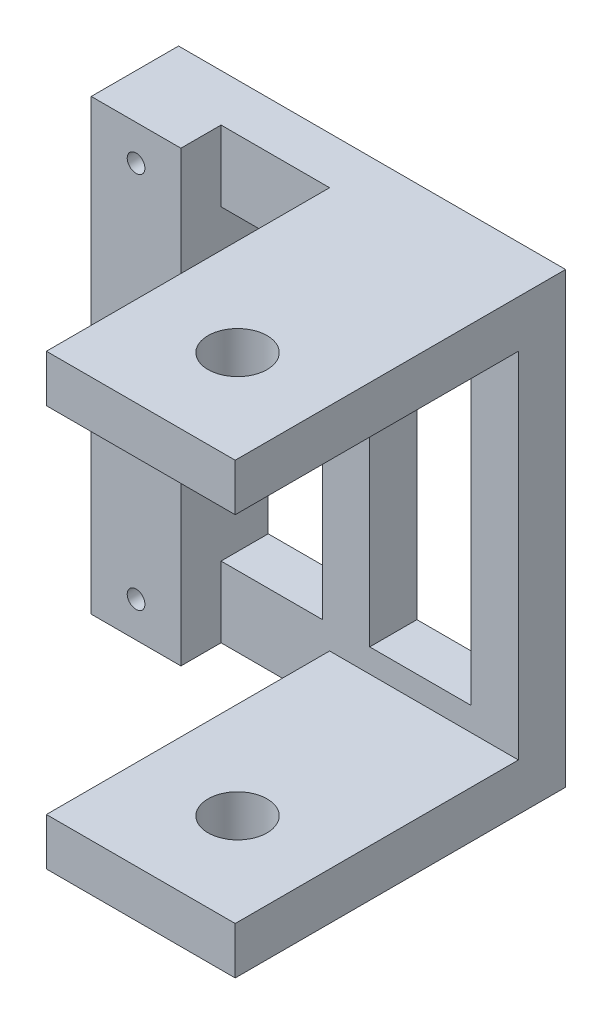
ISO-10303-21;
HEADER;
FILE_DESCRIPTION(('STEP AP214'),'2;1');
FILE_NAME('part.step','',(''),(''),'','','');
FILE_SCHEMA(('AUTOMOTIVE_DESIGN { 1 0 10303 214 1 1 1 1 }'));
ENDSEC;
DATA;
#1=APPLICATION_CONTEXT('core data for automotive mechanical design processes');
#2=APPLICATION_PROTOCOL_DEFINITION('international standard','automotive_design',2000,#1);
#3=PRODUCT_CONTEXT('',#1,'mechanical');
#4=PRODUCT('Part','Part','',(#3));
#5=PRODUCT_RELATED_PRODUCT_CATEGORY('part','',(#4));
#6=PRODUCT_DEFINITION_FORMATION('','',#4);
#7=PRODUCT_DEFINITION_CONTEXT('part definition',#1,'design');
#8=PRODUCT_DEFINITION('design','',#6,#7);
#9=PRODUCT_DEFINITION_SHAPE('','',#8);
#10=(LENGTH_UNIT() NAMED_UNIT(*) SI_UNIT(.MILLI.,.METRE.));
#11=(NAMED_UNIT(*) PLANE_ANGLE_UNIT() SI_UNIT($,.RADIAN.));
#12=(NAMED_UNIT(*) SI_UNIT($,.STERADIAN.) SOLID_ANGLE_UNIT());
#13=UNCERTAINTY_MEASURE_WITH_UNIT(LENGTH_MEASURE(1.E-05),#10,'distance_accuracy_value','');
#14=(GEOMETRIC_REPRESENTATION_CONTEXT(3) GLOBAL_UNCERTAINTY_ASSIGNED_CONTEXT((#13)) GLOBAL_UNIT_ASSIGNED_CONTEXT((#10,
#11,#12)) REPRESENTATION_CONTEXT('',''));
#15=CARTESIAN_POINT('',(0.,0.,0.));
#16=DIRECTION('',(0.,0.,1.));
#17=DIRECTION('',(1.,0.,0.));
#18=AXIS2_PLACEMENT_3D('',#15,#16,#17);
#19=CARTESIAN_POINT('',(0.,0.,2.));
#20=DIRECTION('',(0.,0.,1.));
#21=DIRECTION('',(1.,0.,0.));
#22=AXIS2_PLACEMENT_3D('',#19,#20,#21);
#23=PLANE('',#22);
#24=DIRECTION('',(0.,1.,0.));
#25=VECTOR('',#24,1.);
#26=CARTESIAN_POINT('',(5.29999999999999,6.5,2.));
#27=LINE('',#26,#25);
#28=CARTESIAN_POINT('',(5.29999999999999,-6.5,2.));
#29=VERTEX_POINT('',#28);
#30=CARTESIAN_POINT('',(5.29999999999999,6.5,2.));
#31=VERTEX_POINT('',#30);
#32=EDGE_CURVE('E292',#29,#31,#27,.T.);
#33=ORIENTED_EDGE('',*,*,#32,.F.);
#34=DIRECTION('',(1.,0.,0.));
#35=VECTOR('',#34,1.);
#36=CARTESIAN_POINT('',(0.999999999999998,-6.5,2.));
#37=LINE('',#36,#35);
#38=CARTESIAN_POINT('',(0.999999999999998,-6.5,2.));
#39=VERTEX_POINT('',#38);
#40=EDGE_CURVE('E289',#39,#29,#37,.T.);
#41=ORIENTED_EDGE('',*,*,#40,.F.);
#42=DIRECTION('',(0.,-1.,0.));
#43=VECTOR('',#42,1.);
#44=CARTESIAN_POINT('',(0.999999999999998,-6.5,2.));
#45=LINE('',#44,#43);
#46=CARTESIAN_POINT('',(0.999999999999998,6.5,2.));
#47=VERTEX_POINT('',#46);
#48=EDGE_CURVE('E300',#47,#39,#45,.T.);
#49=ORIENTED_EDGE('',*,*,#48,.F.);
#50=DIRECTION('',(-1.,0.,0.));
#51=VECTOR('',#50,1.);
#52=CARTESIAN_POINT('',(0.999999999999998,6.5,2.));
#53=LINE('',#52,#51);
#54=EDGE_CURVE('E296',#31,#47,#53,.T.);
#55=ORIENTED_EDGE('',*,*,#54,.F.);
#56=EDGE_LOOP('',(#33,#41,#49,#55));
#57=FACE_BOUND('',#56,.T.);
#58=DIRECTION('',(-1.,0.,0.));
#59=VECTOR('',#58,1.);
#60=CARTESIAN_POINT('',(-9.1,9.5,2.));
#61=LINE('',#60,#59);
#62=CARTESIAN_POINT('',(-0.699999999999998,9.5,2.));
#63=VERTEX_POINT('',#62);
#64=CARTESIAN_POINT('',(-5.3,9.5,2.));
#65=VERTEX_POINT('',#64);
#66=EDGE_CURVE('E376',#63,#65,#61,.T.);
#67=ORIENTED_EDGE('',*,*,#66,.T.);
#68=DIRECTION('',(0.,1.,0.));
#69=VECTOR('',#68,1.);
#70=CARTESIAN_POINT('',(-5.3,9.5,2.));
#71=LINE('',#70,#69);
#72=CARTESIAN_POINT('',(-5.3,6.5,2.));
#73=VERTEX_POINT('',#72);
#74=EDGE_CURVE('E208',#73,#65,#71,.T.);
#75=ORIENTED_EDGE('',*,*,#74,.F.);
#76=DIRECTION('',(-1.,0.,0.));
#77=VECTOR('',#76,1.);
#78=CARTESIAN_POINT('',(-5.3,6.5,2.));
#79=LINE('',#78,#77);
#80=CARTESIAN_POINT('',(-1.,6.5,2.));
#81=VERTEX_POINT('',#80);
#82=EDGE_CURVE('E340',#81,#73,#79,.T.);
#83=ORIENTED_EDGE('',*,*,#82,.F.);
#84=DIRECTION('',(0.,1.,0.));
#85=VECTOR('',#84,1.);
#86=CARTESIAN_POINT('',(-1.,-6.5,2.));
#87=LINE('',#86,#85);
#88=CARTESIAN_POINT('',(-1.,-6.5,2.));
#89=VERTEX_POINT('',#88);
#90=EDGE_CURVE('E335',#89,#81,#87,.T.);
#91=ORIENTED_EDGE('',*,*,#90,.F.);
#92=DIRECTION('',(1.,0.,0.));
#93=VECTOR('',#92,1.);
#94=CARTESIAN_POINT('',(-5.3,-6.5,2.));
#95=LINE('',#94,#93);
#96=CARTESIAN_POINT('',(-5.3,-6.5,2.));
#97=VERTEX_POINT('',#96);
#98=EDGE_CURVE('E332',#97,#89,#95,.T.);
#99=ORIENTED_EDGE('',*,*,#98,.F.);
#100=CARTESIAN_POINT('',(-5.29999999999999,-9.5,2.));
#101=VERTEX_POINT('',#100);
#102=EDGE_CURVE('E205',#101,#97,#71,.T.);
#103=ORIENTED_EDGE('',*,*,#102,.F.);
#104=DIRECTION('',(1.,0.,0.));
#105=VECTOR('',#104,1.);
#106=CARTESIAN_POINT('',(-9.1,-9.5,2.));
#107=LINE('',#106,#105);
#108=CARTESIAN_POINT('',(-0.699999999999999,-9.5,2.));
#109=VERTEX_POINT('',#108);
#110=EDGE_CURVE('E381',#101,#109,#107,.T.);
#111=ORIENTED_EDGE('',*,*,#110,.T.);
#112=DIRECTION('',(0.,-1.,0.));
#113=VECTOR('',#112,1.);
#114=CARTESIAN_POINT('',(-0.699999999999999,-7.5,2.));
#115=LINE('',#114,#113);
#116=CARTESIAN_POINT('',(-0.699999999999999,-7.5,2.));
#117=VERTEX_POINT('',#116);
#118=EDGE_CURVE('E57',#117,#109,#115,.T.);
#119=ORIENTED_EDGE('',*,*,#118,.F.);
#120=DIRECTION('',(-1.,0.,0.));
#121=VECTOR('',#120,1.);
#122=CARTESIAN_POINT('',(-0.699999999999999,-7.5,2.));
#123=LINE('',#122,#121);
#124=CARTESIAN_POINT('',(7.3,-7.5,2.));
#125=VERTEX_POINT('',#124);
#126=EDGE_CURVE('E61',#125,#117,#123,.T.);
#127=ORIENTED_EDGE('',*,*,#126,.F.);
#128=DIRECTION('',(0.,1.,0.));
#129=VECTOR('',#128,1.);
#130=CARTESIAN_POINT('',(7.3,9.5,2.));
#131=LINE('',#130,#129);
#132=CARTESIAN_POINT('',(7.3,7.5,2.));
#133=VERTEX_POINT('',#132);
#134=EDGE_CURVE('E373',#125,#133,#131,.T.);
#135=ORIENTED_EDGE('',*,*,#134,.T.);
#136=DIRECTION('',(1.,0.,0.));
#137=VECTOR('',#136,1.);
#138=CARTESIAN_POINT('',(-0.699999999999998,7.5,2.));
#139=LINE('',#138,#137);
#140=CARTESIAN_POINT('',(-0.699999999999998,7.5,2.));
#141=VERTEX_POINT('',#140);
#142=EDGE_CURVE('E260',#141,#133,#139,.T.);
#143=ORIENTED_EDGE('',*,*,#142,.F.);
#144=DIRECTION('',(0.,-1.,0.));
#145=VECTOR('',#144,1.);
#146=CARTESIAN_POINT('',(-0.699999999999998,9.5,2.));
#147=LINE('',#146,#145);
#148=EDGE_CURVE('E254',#63,#141,#147,.T.);
#149=ORIENTED_EDGE('',*,*,#148,.F.);
#150=EDGE_LOOP('',(#67,#75,#83,#91,#99,#103,#111,#119,#127,#135,#143,#149));
#151=FACE_BOUND('',#150,.T.);
#152=ADVANCED_FACE('F40',(#57,#151),#23,.T.);
#153=CARTESIAN_POINT('',(0.,0.,0.));
#154=DIRECTION('',(0.,0.,1.));
#155=DIRECTION('',(1.,0.,0.));
#156=AXIS2_PLACEMENT_3D('',#153,#154,#155);
#157=PLANE('',#156);
#158=CARTESIAN_POINT('',(-7.2,8.,0.));
#159=DIRECTION('',(0.,0.,1.));
#160=DIRECTION('',(1.,0.,0.));
#161=AXIS2_PLACEMENT_3D('',#158,#159,#160);
#162=CIRCLE('',#161,0.375);
#163=CARTESIAN_POINT('',(-6.825,8.,0.));
#164=VERTEX_POINT('',#163);
#165=EDGE_CURVE('E471',#164,#164,#162,.F.);
#166=ORIENTED_EDGE('',*,*,#165,.F.);
#167=EDGE_LOOP('',(#166));
#168=FACE_BOUND('',#167,.T.);
#169=CARTESIAN_POINT('',(-7.2,-8.,0.));
#170=DIRECTION('',(0.,0.,1.));
#171=DIRECTION('',(1.,0.,0.));
#172=AXIS2_PLACEMENT_3D('',#169,#170,#171);
#173=CIRCLE('',#172,0.375);
#174=CARTESIAN_POINT('',(-6.825,-8.,0.));
#175=VERTEX_POINT('',#174);
#176=EDGE_CURVE('E211',#175,#175,#173,.F.);
#177=ORIENTED_EDGE('',*,*,#176,.F.);
#178=EDGE_LOOP('',(#177));
#179=FACE_BOUND('',#178,.T.);
#180=DIRECTION('',(0.,-1.,0.));
#181=VECTOR('',#180,1.);
#182=CARTESIAN_POINT('',(-5.3,6.5,0.));
#183=LINE('',#182,#181);
#184=CARTESIAN_POINT('',(-5.3,6.5,0.));
#185=VERTEX_POINT('',#184);
#186=CARTESIAN_POINT('',(-5.3,-6.5,0.));
#187=VERTEX_POINT('',#186);
#188=EDGE_CURVE('E331',#185,#187,#183,.T.);
#189=ORIENTED_EDGE('',*,*,#188,.T.);
#190=DIRECTION('',(1.,0.,0.));
#191=VECTOR('',#190,1.);
#192=CARTESIAN_POINT('',(-5.3,-6.5,0.));
#193=LINE('',#192,#191);
#194=CARTESIAN_POINT('',(-1.,-6.5,0.));
#195=VERTEX_POINT('',#194);
#196=EDGE_CURVE('E348',#187,#195,#193,.T.);
#197=ORIENTED_EDGE('',*,*,#196,.T.);
#198=DIRECTION('',(0.,1.,0.));
#199=VECTOR('',#198,1.);
#200=CARTESIAN_POINT('',(-1.,-6.5,0.));
#201=LINE('',#200,#199);
#202=CARTESIAN_POINT('',(-1.,6.5,0.));
#203=VERTEX_POINT('',#202);
#204=EDGE_CURVE('E352',#195,#203,#201,.T.);
#205=ORIENTED_EDGE('',*,*,#204,.T.);
#206=DIRECTION('',(-1.,0.,0.));
#207=VECTOR('',#206,1.);
#208=CARTESIAN_POINT('',(-5.3,6.5,0.));
#209=LINE('',#208,#207);
#210=EDGE_CURVE('E336',#203,#185,#209,.T.);
#211=ORIENTED_EDGE('',*,*,#210,.T.);
#212=EDGE_LOOP('',(#189,#197,#205,#211));
#213=FACE_BOUND('',#212,.T.);
#214=DIRECTION('',(0.,1.,0.));
#215=VECTOR('',#214,1.);
#216=CARTESIAN_POINT('',(7.3,9.5,0.));
#217=LINE('',#216,#215);
#218=CARTESIAN_POINT('',(7.3,-9.5,0.));
#219=VERTEX_POINT('',#218);
#220=CARTESIAN_POINT('',(7.3,9.5,0.));
#221=VERTEX_POINT('',#220);
#222=EDGE_CURVE('E372',#219,#221,#217,.T.);
#223=ORIENTED_EDGE('',*,*,#222,.F.);
#224=DIRECTION('',(1.,0.,0.));
#225=VECTOR('',#224,1.);
#226=CARTESIAN_POINT('',(-9.1,-9.5,0.));
#227=LINE('',#226,#225);
#228=CARTESIAN_POINT('',(-9.1,-9.5,0.));
#229=VERTEX_POINT('',#228);
#230=EDGE_CURVE('E377',#229,#219,#227,.T.);
#231=ORIENTED_EDGE('',*,*,#230,.F.);
#232=DIRECTION('',(0.,-1.,0.));
#233=VECTOR('',#232,1.);
#234=CARTESIAN_POINT('',(-9.1,9.5,0.));
#235=LINE('',#234,#233);
#236=CARTESIAN_POINT('',(-9.1,9.5,0.));
#237=VERTEX_POINT('',#236);
#238=EDGE_CURVE('E184',#237,#229,#235,.T.);
#239=ORIENTED_EDGE('',*,*,#238,.F.);
#240=DIRECTION('',(-1.,0.,0.));
#241=VECTOR('',#240,1.);
#242=CARTESIAN_POINT('',(-9.1,9.5,0.));
#243=LINE('',#242,#241);
#244=EDGE_CURVE('E387',#221,#237,#243,.T.);
#245=ORIENTED_EDGE('',*,*,#244,.F.);
#246=EDGE_LOOP('',(#223,#231,#239,#245));
#247=FACE_BOUND('',#246,.T.);
#248=DIRECTION('',(1.,0.,0.));
#249=VECTOR('',#248,1.);
#250=CARTESIAN_POINT('',(0.999999999999998,-6.5,0.));
#251=LINE('',#250,#249);
#252=CARTESIAN_POINT('',(0.999999999999998,-6.5,0.));
#253=VERTEX_POINT('',#252);
#254=CARTESIAN_POINT('',(5.29999999999999,-6.5,0.));
#255=VERTEX_POINT('',#254);
#256=EDGE_CURVE('E288',#253,#255,#251,.T.);
#257=ORIENTED_EDGE('',*,*,#256,.T.);
#258=DIRECTION('',(0.,1.,0.));
#259=VECTOR('',#258,1.);
#260=CARTESIAN_POINT('',(5.29999999999999,6.5,0.));
#261=LINE('',#260,#259);
#262=CARTESIAN_POINT('',(5.29999999999999,6.5,0.));
#263=VERTEX_POINT('',#262);
#264=EDGE_CURVE('E307',#255,#263,#261,.T.);
#265=ORIENTED_EDGE('',*,*,#264,.T.);
#266=DIRECTION('',(-1.,0.,0.));
#267=VECTOR('',#266,1.);
#268=CARTESIAN_POINT('',(0.999999999999998,6.5,0.));
#269=LINE('',#268,#267);
#270=CARTESIAN_POINT('',(0.999999999999998,6.5,0.));
#271=VERTEX_POINT('',#270);
#272=EDGE_CURVE('E311',#263,#271,#269,.T.);
#273=ORIENTED_EDGE('',*,*,#272,.T.);
#274=DIRECTION('',(0.,-1.,0.));
#275=VECTOR('',#274,1.);
#276=CARTESIAN_POINT('',(0.999999999999998,-6.5,0.));
#277=LINE('',#276,#275);
#278=EDGE_CURVE('E293',#271,#253,#277,.T.);
#279=ORIENTED_EDGE('',*,*,#278,.T.);
#280=EDGE_LOOP('',(#257,#265,#273,#279));
#281=FACE_BOUND('',#280,.T.);
#282=ADVANCED_FACE('F401',(#168,#179,#213,#247,#281),#157,.F.);
#283=CARTESIAN_POINT('',(7.3,9.5,2.));
#284=DIRECTION('',(-1.,0.,0.));
#285=DIRECTION('',(0.,-1.,0.));
#286=AXIS2_PLACEMENT_3D('',#283,#284,#285);
#287=PLANE('',#286);
#288=ORIENTED_EDGE('',*,*,#222,.T.);
#289=DIRECTION('',(0.,0.,-1.));
#290=VECTOR('',#289,1.);
#291=CARTESIAN_POINT('',(7.3,9.5,2.));
#292=LINE('',#291,#290);
#293=CARTESIAN_POINT('',(7.3,9.5,14.));
#294=VERTEX_POINT('',#293);
#295=EDGE_CURVE('E12',#294,#221,#292,.T.);
#296=ORIENTED_EDGE('',*,*,#295,.F.);
#297=DIRECTION('',(0.,1.,0.));
#298=VECTOR('',#297,1.);
#299=CARTESIAN_POINT('',(7.3,9.5,14.));
#300=LINE('',#299,#298);
#301=CARTESIAN_POINT('',(7.3,7.5,14.));
#302=VERTEX_POINT('',#301);
#303=EDGE_CURVE('E263',#302,#294,#300,.T.);
#304=ORIENTED_EDGE('',*,*,#303,.F.);
#305=DIRECTION('',(0.,0.,-1.));
#306=VECTOR('',#305,1.);
#307=CARTESIAN_POINT('',(7.3,7.5,14.));
#308=LINE('',#307,#306);
#309=EDGE_CURVE('E280',#302,#133,#308,.T.);
#310=ORIENTED_EDGE('',*,*,#309,.T.);
#311=ORIENTED_EDGE('',*,*,#134,.F.);
#312=DIRECTION('',(0.,0.,-1.));
#313=VECTOR('',#312,1.);
#314=CARTESIAN_POINT('',(7.3,-7.5,14.));
#315=LINE('',#314,#313);
#316=CARTESIAN_POINT('',(7.3,-7.5,14.));
#317=VERTEX_POINT('',#316);
#318=EDGE_CURVE('E250',#317,#125,#315,.T.);
#319=ORIENTED_EDGE('',*,*,#318,.F.);
#320=DIRECTION('',(0.,1.,0.));
#321=VECTOR('',#320,1.);
#322=CARTESIAN_POINT('',(7.3,-7.5,14.));
#323=LINE('',#322,#321);
#324=CARTESIAN_POINT('',(7.3,-9.5,14.));
#325=VERTEX_POINT('',#324);
#326=EDGE_CURVE('E224',#325,#317,#323,.T.);
#327=ORIENTED_EDGE('',*,*,#326,.F.);
#328=DIRECTION('',(0.,0.,-1.));
#329=VECTOR('',#328,1.);
#330=CARTESIAN_POINT('',(7.3,-9.5,2.));
#331=LINE('',#330,#329);
#332=EDGE_CURVE('E188',#325,#219,#331,.T.);
#333=ORIENTED_EDGE('',*,*,#332,.T.);
#334=EDGE_LOOP('',(#288,#296,#304,#310,#311,#319,#327,#333));
#335=FACE_BOUND('',#334,.T.);
#336=ADVANCED_FACE('F42',(#335),#287,.F.);
#337=CARTESIAN_POINT('',(-9.1,9.5,2.));
#338=DIRECTION('',(0.,-1.,0.));
#339=DIRECTION('',(0.,0.,-1.));
#340=AXIS2_PLACEMENT_3D('',#337,#338,#339);
#341=PLANE('',#340);
#342=CARTESIAN_POINT('',(3.4,9.5,10.));
#343=DIRECTION('',(0.,-1.,0.));
#344=DIRECTION('',(0.,0.,-1.));
#345=AXIS2_PLACEMENT_3D('',#342,#343,#344);
#346=CIRCLE('',#345,1.25);
#347=CARTESIAN_POINT('',(3.4,9.5,8.75000000000003));
#348=VERTEX_POINT('',#347);
#349=EDGE_CURVE('E454',#348,#348,#346,.T.);
#350=ORIENTED_EDGE('',*,*,#349,.T.);
#351=EDGE_LOOP('',(#350));
#352=FACE_BOUND('',#351,.T.);
#353=ORIENTED_EDGE('',*,*,#244,.T.);
#354=DIRECTION('',(0.,0.,-1.));
#355=VECTOR('',#354,1.);
#356=CARTESIAN_POINT('',(-9.1,9.5,2.));
#357=LINE('',#356,#355);
#358=CARTESIAN_POINT('',(-9.1,9.5,3.7));
#359=VERTEX_POINT('',#358);
#360=EDGE_CURVE('E50',#359,#237,#357,.T.);
#361=ORIENTED_EDGE('',*,*,#360,.F.);
#362=DIRECTION('',(-1.,0.,0.));
#363=VECTOR('',#362,1.);
#364=CARTESIAN_POINT('',(-9.1,9.5,3.7));
#365=LINE('',#364,#363);
#366=CARTESIAN_POINT('',(-5.3,9.5,3.7));
#367=VERTEX_POINT('',#366);
#368=EDGE_CURVE('E203',#367,#359,#365,.T.);
#369=ORIENTED_EDGE('',*,*,#368,.F.);
#370=DIRECTION('',(0.,0.,-1.));
#371=VECTOR('',#370,1.);
#372=CARTESIAN_POINT('',(-5.3,9.5,3.7));
#373=LINE('',#372,#371);
#374=EDGE_CURVE('E217',#367,#65,#373,.T.);
#375=ORIENTED_EDGE('',*,*,#374,.T.);
#376=ORIENTED_EDGE('',*,*,#66,.F.);
#377=DIRECTION('',(0.,0.,-1.));
#378=VECTOR('',#377,1.);
#379=CARTESIAN_POINT('',(-0.699999999999998,9.5,14.));
#380=LINE('',#379,#378);
#381=CARTESIAN_POINT('',(-0.699999999999998,9.5,14.));
#382=VERTEX_POINT('',#381);
#383=EDGE_CURVE('E270',#382,#63,#380,.T.);
#384=ORIENTED_EDGE('',*,*,#383,.F.);
#385=DIRECTION('',(-1.,0.,0.));
#386=VECTOR('',#385,1.);
#387=CARTESIAN_POINT('',(-0.699999999999998,9.5,14.));
#388=LINE('',#387,#386);
#389=EDGE_CURVE('E267',#294,#382,#388,.T.);
#390=ORIENTED_EDGE('',*,*,#389,.F.);
#391=ORIENTED_EDGE('',*,*,#295,.T.);
#392=EDGE_LOOP('',(#353,#361,#369,#375,#376,#384,#390,#391));
#393=FACE_BOUND('',#392,.T.);
#394=ADVANCED_FACE('F446',(#352,#393),#341,.F.);
#395=CARTESIAN_POINT('',(-9.1,9.5,2.));
#396=DIRECTION('',(1.,0.,0.));
#397=DIRECTION('',(0.,1.,0.));
#398=AXIS2_PLACEMENT_3D('',#395,#396,#397);
#399=PLANE('',#398);
#400=ORIENTED_EDGE('',*,*,#238,.T.);
#401=DIRECTION('',(0.,0.,-1.));
#402=VECTOR('',#401,1.);
#403=CARTESIAN_POINT('',(-9.1,-9.5,2.));
#404=LINE('',#403,#402);
#405=CARTESIAN_POINT('',(-9.1,-9.5,3.7));
#406=VERTEX_POINT('',#405);
#407=EDGE_CURVE('E177',#406,#229,#404,.T.);
#408=ORIENTED_EDGE('',*,*,#407,.F.);
#409=DIRECTION('',(0.,-1.,0.));
#410=VECTOR('',#409,1.);
#411=CARTESIAN_POINT('',(-9.1,9.5,3.7));
#412=LINE('',#411,#410);
#413=EDGE_CURVE('E182',#359,#406,#412,.T.);
#414=ORIENTED_EDGE('',*,*,#413,.F.);
#415=ORIENTED_EDGE('',*,*,#360,.T.);
#416=EDGE_LOOP('',(#400,#408,#414,#415));
#417=FACE_BOUND('',#416,.T.);
#418=ADVANCED_FACE('F179',(#417),#399,.F.);
#419=CARTESIAN_POINT('',(-9.1,-9.5,2.));
#420=DIRECTION('',(0.,1.,0.));
#421=DIRECTION('',(-1.,0.,0.));
#422=AXIS2_PLACEMENT_3D('',#419,#420,#421);
#423=PLANE('',#422);
#424=CARTESIAN_POINT('',(3.4,-9.5,10.));
#425=DIRECTION('',(0.,-1.,0.));
#426=DIRECTION('',(0.,0.,-1.));
#427=AXIS2_PLACEMENT_3D('',#424,#425,#426);
#428=CIRCLE('',#427,1.25);
#429=CARTESIAN_POINT('',(3.4,-9.5,8.75000000000003));
#430=VERTEX_POINT('',#429);
#431=EDGE_CURVE('E528',#430,#430,#428,.T.);
#432=ORIENTED_EDGE('',*,*,#431,.F.);
#433=EDGE_LOOP('',(#432));
#434=FACE_BOUND('',#433,.T.);
#435=ORIENTED_EDGE('',*,*,#230,.T.);
#436=ORIENTED_EDGE('',*,*,#332,.F.);
#437=DIRECTION('',(1.,0.,0.));
#438=VECTOR('',#437,1.);
#439=CARTESIAN_POINT('',(-0.699999999999998,-9.5,14.));
#440=LINE('',#439,#438);
#441=CARTESIAN_POINT('',(-0.699999999999998,-9.5,14.));
#442=VERTEX_POINT('',#441);
#443=EDGE_CURVE('E234',#442,#325,#440,.T.);
#444=ORIENTED_EDGE('',*,*,#443,.F.);
#445=DIRECTION('',(0.,0.,-1.));
#446=VECTOR('',#445,1.);
#447=CARTESIAN_POINT('',(-0.699999999999998,-9.5,14.));
#448=LINE('',#447,#446);
#449=EDGE_CURVE('E238',#442,#109,#448,.T.);
#450=ORIENTED_EDGE('',*,*,#449,.T.);
#451=ORIENTED_EDGE('',*,*,#110,.F.);
#452=DIRECTION('',(0.,0.,-1.));
#453=VECTOR('',#452,1.);
#454=CARTESIAN_POINT('',(-5.29999999999999,-9.5,3.7));
#455=LINE('',#454,#453);
#456=CARTESIAN_POINT('',(-5.29999999999999,-9.5,3.7));
#457=VERTEX_POINT('',#456);
#458=EDGE_CURVE('E194',#457,#101,#455,.T.);
#459=ORIENTED_EDGE('',*,*,#458,.F.);
#460=DIRECTION('',(1.,0.,0.));
#461=VECTOR('',#460,1.);
#462=CARTESIAN_POINT('',(-9.1,-9.5,3.7));
#463=LINE('',#462,#461);
#464=EDGE_CURVE('E191',#406,#457,#463,.T.);
#465=ORIENTED_EDGE('',*,*,#464,.F.);
#466=ORIENTED_EDGE('',*,*,#407,.T.);
#467=EDGE_LOOP('',(#435,#436,#444,#450,#451,#459,#465,#466));
#468=FACE_BOUND('',#467,.T.);
#469=ADVANCED_FACE('F192',(#434,#468),#423,.F.);
#470=CARTESIAN_POINT('',(-5.3,6.5,2.));
#471=DIRECTION('',(1.,0.,0.));
#472=DIRECTION('',(0.,0.,-1.));
#473=AXIS2_PLACEMENT_3D('',#470,#471,#472);
#474=PLANE('',#473);
#475=ORIENTED_EDGE('',*,*,#188,.F.);
#476=DIRECTION('',(0.,0.,-1.));
#477=VECTOR('',#476,1.);
#478=CARTESIAN_POINT('',(-5.3,6.5,2.));
#479=LINE('',#478,#477);
#480=EDGE_CURVE('E344',#73,#185,#479,.T.);
#481=ORIENTED_EDGE('',*,*,#480,.F.);
#482=ORIENTED_EDGE('',*,*,#74,.T.);
#483=ORIENTED_EDGE('',*,*,#374,.F.);
#484=DIRECTION('',(0.,1.,0.));
#485=VECTOR('',#484,1.);
#486=CARTESIAN_POINT('',(-5.3,9.5,3.7));
#487=LINE('',#486,#485);
#488=EDGE_CURVE('E198',#457,#367,#487,.T.);
#489=ORIENTED_EDGE('',*,*,#488,.F.);
#490=ORIENTED_EDGE('',*,*,#458,.T.);
#491=ORIENTED_EDGE('',*,*,#102,.T.);
#492=DIRECTION('',(0.,0.,-1.));
#493=VECTOR('',#492,1.);
#494=CARTESIAN_POINT('',(-5.3,-6.5,2.));
#495=LINE('',#494,#493);
#496=EDGE_CURVE('E368',#97,#187,#495,.T.);
#497=ORIENTED_EDGE('',*,*,#496,.T.);
#498=EDGE_LOOP('',(#475,#481,#482,#483,#489,#490,#491,#497));
#499=FACE_BOUND('',#498,.T.);
#500=ADVANCED_FACE('F439',(#499),#474,.T.);
#501=CARTESIAN_POINT('',(-5.3,-6.5,2.));
#502=DIRECTION('',(0.,1.,0.));
#503=DIRECTION('',(-1.,0.,0.));
#504=AXIS2_PLACEMENT_3D('',#501,#502,#503);
#505=PLANE('',#504);
#506=ORIENTED_EDGE('',*,*,#196,.F.);
#507=ORIENTED_EDGE('',*,*,#496,.F.);
#508=ORIENTED_EDGE('',*,*,#98,.T.);
#509=DIRECTION('',(0.,0.,-1.));
#510=VECTOR('',#509,1.);
#511=CARTESIAN_POINT('',(-1.,-6.5,2.));
#512=LINE('',#511,#510);
#513=EDGE_CURVE('E365',#89,#195,#512,.T.);
#514=ORIENTED_EDGE('',*,*,#513,.T.);
#515=EDGE_LOOP('',(#506,#507,#508,#514));
#516=FACE_BOUND('',#515,.T.);
#517=ADVANCED_FACE('F484',(#516),#505,.T.);
#518=CARTESIAN_POINT('',(-1.,-6.5,2.));
#519=DIRECTION('',(-1.,0.,0.));
#520=DIRECTION('',(0.,0.,1.));
#521=AXIS2_PLACEMENT_3D('',#518,#519,#520);
#522=PLANE('',#521);
#523=ORIENTED_EDGE('',*,*,#204,.F.);
#524=ORIENTED_EDGE('',*,*,#513,.F.);
#525=ORIENTED_EDGE('',*,*,#90,.T.);
#526=DIRECTION('',(0.,0.,-1.));
#527=VECTOR('',#526,1.);
#528=CARTESIAN_POINT('',(-1.,6.5,2.));
#529=LINE('',#528,#527);
#530=EDGE_CURVE('E362',#81,#203,#529,.T.);
#531=ORIENTED_EDGE('',*,*,#530,.T.);
#532=EDGE_LOOP('',(#523,#524,#525,#531));
#533=FACE_BOUND('',#532,.T.);
#534=ADVANCED_FACE('F480',(#533),#522,.T.);
#535=CARTESIAN_POINT('',(-5.3,6.5,2.));
#536=DIRECTION('',(0.,-1.,0.));
#537=DIRECTION('',(1.,0.,0.));
#538=AXIS2_PLACEMENT_3D('',#535,#536,#537);
#539=PLANE('',#538);
#540=ORIENTED_EDGE('',*,*,#210,.F.);
#541=ORIENTED_EDGE('',*,*,#530,.F.);
#542=ORIENTED_EDGE('',*,*,#82,.T.);
#543=ORIENTED_EDGE('',*,*,#480,.T.);
#544=EDGE_LOOP('',(#540,#541,#542,#543));
#545=FACE_BOUND('',#544,.T.);
#546=ADVANCED_FACE('F474',(#545),#539,.T.);
#547=CARTESIAN_POINT('',(0.999999999999998,-6.5,2.));
#548=DIRECTION('',(0.,1.,0.));
#549=DIRECTION('',(0.,0.,1.));
#550=AXIS2_PLACEMENT_3D('',#547,#548,#549);
#551=PLANE('',#550);
#552=ORIENTED_EDGE('',*,*,#256,.F.);
#553=DIRECTION('',(0.,0.,-1.));
#554=VECTOR('',#553,1.);
#555=CARTESIAN_POINT('',(0.999999999999998,-6.5,2.));
#556=LINE('',#555,#554);
#557=EDGE_CURVE('E303',#39,#253,#556,.T.);
#558=ORIENTED_EDGE('',*,*,#557,.F.);
#559=ORIENTED_EDGE('',*,*,#40,.T.);
#560=DIRECTION('',(0.,0.,-1.));
#561=VECTOR('',#560,1.);
#562=CARTESIAN_POINT('',(5.29999999999999,-6.5,2.));
#563=LINE('',#562,#561);
#564=EDGE_CURVE('E327',#29,#255,#563,.T.);
#565=ORIENTED_EDGE('',*,*,#564,.T.);
#566=EDGE_LOOP('',(#552,#558,#559,#565));
#567=FACE_BOUND('',#566,.T.);
#568=ADVANCED_FACE('F494',(#567),#551,.T.);
#569=CARTESIAN_POINT('',(5.29999999999999,6.5,2.));
#570=DIRECTION('',(-1.,0.,0.));
#571=DIRECTION('',(0.,0.,1.));
#572=AXIS2_PLACEMENT_3D('',#569,#570,#571);
#573=PLANE('',#572);
#574=ORIENTED_EDGE('',*,*,#264,.F.);
#575=ORIENTED_EDGE('',*,*,#564,.F.);
#576=ORIENTED_EDGE('',*,*,#32,.T.);
#577=DIRECTION('',(0.,0.,-1.));
#578=VECTOR('',#577,1.);
#579=CARTESIAN_POINT('',(5.29999999999999,6.5,2.));
#580=LINE('',#579,#578);
#581=EDGE_CURVE('E324',#31,#263,#580,.T.);
#582=ORIENTED_EDGE('',*,*,#581,.T.);
#583=EDGE_LOOP('',(#574,#575,#576,#582));
#584=FACE_BOUND('',#583,.T.);
#585=ADVANCED_FACE('F497',(#584),#573,.T.);
#586=CARTESIAN_POINT('',(0.999999999999998,6.5,2.));
#587=DIRECTION('',(0.,-1.,0.));
#588=DIRECTION('',(0.,0.,-1.));
#589=AXIS2_PLACEMENT_3D('',#586,#587,#588);
#590=PLANE('',#589);
#591=ORIENTED_EDGE('',*,*,#272,.F.);
#592=ORIENTED_EDGE('',*,*,#581,.F.);
#593=ORIENTED_EDGE('',*,*,#54,.T.);
#594=DIRECTION('',(0.,0.,-1.));
#595=VECTOR('',#594,1.);
#596=CARTESIAN_POINT('',(0.999999999999998,6.5,2.));
#597=LINE('',#596,#595);
#598=EDGE_CURVE('E321',#47,#271,#597,.T.);
#599=ORIENTED_EDGE('',*,*,#598,.T.);
#600=EDGE_LOOP('',(#591,#592,#593,#599));
#601=FACE_BOUND('',#600,.T.);
#602=ADVANCED_FACE('F501',(#601),#590,.T.);
#603=CARTESIAN_POINT('',(0.999999999999998,-6.5,2.));
#604=DIRECTION('',(1.,0.,0.));
#605=DIRECTION('',(0.,0.,-1.));
#606=AXIS2_PLACEMENT_3D('',#603,#604,#605);
#607=PLANE('',#606);
#608=ORIENTED_EDGE('',*,*,#278,.F.);
#609=ORIENTED_EDGE('',*,*,#598,.F.);
#610=ORIENTED_EDGE('',*,*,#48,.T.);
#611=ORIENTED_EDGE('',*,*,#557,.T.);
#612=EDGE_LOOP('',(#608,#609,#610,#611));
#613=FACE_BOUND('',#612,.T.);
#614=ADVANCED_FACE('F505',(#613),#607,.T.);
#615=CARTESIAN_POINT('',(-0.699999999999998,9.5,14.));
#616=DIRECTION('',(1.,0.,0.));
#617=DIRECTION('',(0.,1.,0.));
#618=AXIS2_PLACEMENT_3D('',#615,#616,#617);
#619=PLANE('',#618);
#620=ORIENTED_EDGE('',*,*,#148,.T.);
#621=DIRECTION('',(0.,0.,-1.));
#622=VECTOR('',#621,1.);
#623=CARTESIAN_POINT('',(-0.699999999999998,7.5,14.));
#624=LINE('',#623,#622);
#625=CARTESIAN_POINT('',(-0.699999999999998,7.5,14.));
#626=VERTEX_POINT('',#625);
#627=EDGE_CURVE('E284',#626,#141,#624,.T.);
#628=ORIENTED_EDGE('',*,*,#627,.F.);
#629=DIRECTION('',(0.,-1.,0.));
#630=VECTOR('',#629,1.);
#631=CARTESIAN_POINT('',(-0.699999999999998,9.5,14.));
#632=LINE('',#631,#630);
#633=EDGE_CURVE('E255',#382,#626,#632,.T.);
#634=ORIENTED_EDGE('',*,*,#633,.F.);
#635=ORIENTED_EDGE('',*,*,#383,.T.);
#636=EDGE_LOOP('',(#620,#628,#634,#635));
#637=FACE_BOUND('',#636,.T.);
#638=ADVANCED_FACE('F464',(#637),#619,.F.);
#639=CARTESIAN_POINT('',(-0.699999999999998,7.5,14.));
#640=DIRECTION('',(0.,1.,0.));
#641=DIRECTION('',(0.,0.,1.));
#642=AXIS2_PLACEMENT_3D('',#639,#640,#641);
#643=PLANE('',#642);
#644=CARTESIAN_POINT('',(3.4,7.5,10.));
#645=DIRECTION('',(0.,1.,0.));
#646=DIRECTION('',(0.,0.,1.));
#647=AXIS2_PLACEMENT_3D('',#644,#645,#646);
#648=CIRCLE('',#647,1.25);
#649=CARTESIAN_POINT('',(3.4,7.5,11.25));
#650=VERTEX_POINT('',#649);
#651=EDGE_CURVE('E518',#650,#650,#648,.T.);
#652=ORIENTED_EDGE('',*,*,#651,.T.);
#653=EDGE_LOOP('',(#652));
#654=FACE_BOUND('',#653,.T.);
#655=ORIENTED_EDGE('',*,*,#142,.T.);
#656=ORIENTED_EDGE('',*,*,#309,.F.);
#657=DIRECTION('',(1.,0.,0.));
#658=VECTOR('',#657,1.);
#659=CARTESIAN_POINT('',(-0.699999999999998,7.5,14.));
#660=LINE('',#659,#658);
#661=EDGE_CURVE('E259',#626,#302,#660,.T.);
#662=ORIENTED_EDGE('',*,*,#661,.F.);
#663=ORIENTED_EDGE('',*,*,#627,.T.);
#664=EDGE_LOOP('',(#655,#656,#662,#663));
#665=FACE_BOUND('',#664,.T.);
#666=ADVANCED_FACE('F425',(#654,#665),#643,.F.);
#667=CARTESIAN_POINT('',(0.,0.,14.));
#668=DIRECTION('',(0.,0.,1.));
#669=DIRECTION('',(1.,0.,0.));
#670=AXIS2_PLACEMENT_3D('',#667,#668,#669);
#671=PLANE('',#670);
#672=ORIENTED_EDGE('',*,*,#633,.T.);
#673=ORIENTED_EDGE('',*,*,#661,.T.);
#674=ORIENTED_EDGE('',*,*,#303,.T.);
#675=ORIENTED_EDGE('',*,*,#389,.T.);
#676=EDGE_LOOP('',(#672,#673,#674,#675));
#677=FACE_BOUND('',#676,.T.);
#678=ADVANCED_FACE('F417',(#677),#671,.T.);
#679=CARTESIAN_POINT('',(-0.699999999999999,-7.5,14.));
#680=DIRECTION('',(0.,-1.,0.));
#681=DIRECTION('',(0.,0.,-1.));
#682=AXIS2_PLACEMENT_3D('',#679,#680,#681);
#683=PLANE('',#682);
#684=CARTESIAN_POINT('',(3.4,-7.5,10.));
#685=DIRECTION('',(0.,-1.,0.));
#686=DIRECTION('',(0.,0.,-1.));
#687=AXIS2_PLACEMENT_3D('',#684,#685,#686);
#688=CIRCLE('',#687,1.25);
#689=CARTESIAN_POINT('',(3.4,-7.5,8.75000000000003));
#690=VERTEX_POINT('',#689);
#691=EDGE_CURVE('E44',#690,#690,#688,.T.);
#692=ORIENTED_EDGE('',*,*,#691,.T.);
#693=EDGE_LOOP('',(#692));
#694=FACE_BOUND('',#693,.T.);
#695=ORIENTED_EDGE('',*,*,#126,.T.);
#696=DIRECTION('',(0.,0.,-1.));
#697=VECTOR('',#696,1.);
#698=CARTESIAN_POINT('',(-0.699999999999999,-7.5,14.));
#699=LINE('',#698,#697);
#700=CARTESIAN_POINT('',(-0.699999999999999,-7.5,14.));
#701=VERTEX_POINT('',#700);
#702=EDGE_CURVE('E246',#701,#117,#699,.T.);
#703=ORIENTED_EDGE('',*,*,#702,.F.);
#704=DIRECTION('',(-1.,0.,0.));
#705=VECTOR('',#704,1.);
#706=CARTESIAN_POINT('',(-0.699999999999999,-7.5,14.));
#707=LINE('',#706,#705);
#708=EDGE_CURVE('E228',#317,#701,#707,.T.);
#709=ORIENTED_EDGE('',*,*,#708,.F.);
#710=ORIENTED_EDGE('',*,*,#318,.T.);
#711=EDGE_LOOP('',(#695,#703,#709,#710));
#712=FACE_BOUND('',#711,.T.);
#713=ADVANCED_FACE('F415',(#694,#712),#683,.F.);
#714=CARTESIAN_POINT('',(-0.699999999999999,-7.5,14.));
#715=DIRECTION('',(1.,0.,0.));
#716=DIRECTION('',(0.,1.,0.));
#717=AXIS2_PLACEMENT_3D('',#714,#715,#716);
#718=PLANE('',#717);
#719=ORIENTED_EDGE('',*,*,#118,.T.);
#720=ORIENTED_EDGE('',*,*,#449,.F.);
#721=DIRECTION('',(0.,-1.,0.));
#722=VECTOR('',#721,1.);
#723=CARTESIAN_POINT('',(-0.699999999999999,-7.5,14.));
#724=LINE('',#723,#722);
#725=EDGE_CURVE('E231',#701,#442,#724,.T.);
#726=ORIENTED_EDGE('',*,*,#725,.F.);
#727=ORIENTED_EDGE('',*,*,#702,.T.);
#728=EDGE_LOOP('',(#719,#720,#726,#727));
#729=FACE_BOUND('',#728,.T.);
#730=ADVANCED_FACE('F413',(#729),#718,.F.);
#731=CARTESIAN_POINT('',(0.,0.,14.));
#732=DIRECTION('',(0.,0.,1.));
#733=DIRECTION('',(1.,0.,0.));
#734=AXIS2_PLACEMENT_3D('',#731,#732,#733);
#735=PLANE('',#734);
#736=ORIENTED_EDGE('',*,*,#326,.T.);
#737=ORIENTED_EDGE('',*,*,#708,.T.);
#738=ORIENTED_EDGE('',*,*,#725,.T.);
#739=ORIENTED_EDGE('',*,*,#443,.T.);
#740=EDGE_LOOP('',(#736,#737,#738,#739));
#741=FACE_BOUND('',#740,.T.);
#742=ADVANCED_FACE('F408',(#741),#735,.T.);
#743=CARTESIAN_POINT('',(0.,0.,3.7));
#744=DIRECTION('',(0.,0.,1.));
#745=DIRECTION('',(1.,0.,0.));
#746=AXIS2_PLACEMENT_3D('',#743,#744,#745);
#747=PLANE('',#746);
#748=CARTESIAN_POINT('',(-7.2,8.,3.7));
#749=DIRECTION('',(0.,0.,1.));
#750=DIRECTION('',(1.,0.,0.));
#751=AXIS2_PLACEMENT_3D('',#748,#749,#750);
#752=CIRCLE('',#751,0.375);
#753=CARTESIAN_POINT('',(-6.825,8.,3.7));
#754=VERTEX_POINT('',#753);
#755=EDGE_CURVE('E530',#754,#754,#752,.T.);
#756=ORIENTED_EDGE('',*,*,#755,.F.);
#757=EDGE_LOOP('',(#756));
#758=FACE_BOUND('',#757,.T.);
#759=CARTESIAN_POINT('',(-7.2,-8.,3.7));
#760=DIRECTION('',(0.,0.,1.));
#761=DIRECTION('',(1.,0.,0.));
#762=AXIS2_PLACEMENT_3D('',#759,#760,#761);
#763=CIRCLE('',#762,0.375);
#764=CARTESIAN_POINT('',(-6.825,-8.,3.7));
#765=VERTEX_POINT('',#764);
#766=EDGE_CURVE('E521',#765,#765,#763,.T.);
#767=ORIENTED_EDGE('',*,*,#766,.F.);
#768=EDGE_LOOP('',(#767));
#769=FACE_BOUND('',#768,.T.);
#770=ORIENTED_EDGE('',*,*,#413,.T.);
#771=ORIENTED_EDGE('',*,*,#464,.T.);
#772=ORIENTED_EDGE('',*,*,#488,.T.);
#773=ORIENTED_EDGE('',*,*,#368,.T.);
#774=EDGE_LOOP('',(#770,#771,#772,#773));
#775=FACE_BOUND('',#774,.T.);
#776=ADVANCED_FACE('F201',(#758,#769,#775),#747,.T.);
#777=CARTESIAN_POINT('',(-7.2,-8.,-0.00100000000000013));
#778=DIRECTION('',(0.,0.,1.));
#779=DIRECTION('',(1.,0.,0.));
#780=AXIS2_PLACEMENT_3D('',#777,#778,#779);
#781=CYLINDRICAL_SURFACE('',#780,0.375);
#782=ORIENTED_EDGE('',*,*,#766,.T.);
#783=EDGE_LOOP('',(#782));
#784=FACE_BOUND('',#783,.T.);
#785=ORIENTED_EDGE('',*,*,#176,.T.);
#786=EDGE_LOOP('',(#785));
#787=FACE_BOUND('',#786,.T.);
#788=ADVANCED_FACE('F544',(#784,#787),#781,.F.);
#789=CARTESIAN_POINT('',(-7.2,8.,-0.00100000000000013));
#790=DIRECTION('',(0.,0.,1.));
#791=DIRECTION('',(1.,0.,0.));
#792=AXIS2_PLACEMENT_3D('',#789,#790,#791);
#793=CYLINDRICAL_SURFACE('',#792,0.375);
#794=ORIENTED_EDGE('',*,*,#755,.T.);
#795=EDGE_LOOP('',(#794));
#796=FACE_BOUND('',#795,.T.);
#797=ORIENTED_EDGE('',*,*,#165,.T.);
#798=EDGE_LOOP('',(#797));
#799=FACE_BOUND('',#798,.T.);
#800=ADVANCED_FACE('F538',(#796,#799),#793,.F.);
#801=CARTESIAN_POINT('',(3.4,9.5,10.));
#802=DIRECTION('',(0.,-1.,0.));
#803=DIRECTION('',(0.,0.,-1.));
#804=AXIS2_PLACEMENT_3D('',#801,#802,#803);
#805=CYLINDRICAL_SURFACE('',#804,1.25);
#806=ORIENTED_EDGE('',*,*,#431,.T.);
#807=EDGE_LOOP('',(#806));
#808=FACE_BOUND('',#807,.T.);
#809=ORIENTED_EDGE('',*,*,#691,.F.);
#810=EDGE_LOOP('',(#809));
#811=FACE_BOUND('',#810,.T.);
#812=ADVANCED_FACE('F552',(#808,#811),#805,.F.);
#813=ORIENTED_EDGE('',*,*,#349,.F.);
#814=EDGE_LOOP('',(#813));
#815=FACE_BOUND('',#814,.T.);
#816=ORIENTED_EDGE('',*,*,#651,.F.);
#817=EDGE_LOOP('',(#816));
#818=FACE_BOUND('',#817,.T.);
#819=ADVANCED_FACE('F617',(#815,#818),#805,.F.);
#820=CLOSED_SHELL('',(#152,#282,#336,#394,#418,#469,#500,#517,#534,#546,#568,#585,#602,#614,
#638,#666,#678,#713,#730,#742,#776,#788,#800,#812,#819));
#821=MANIFOLD_SOLID_BREP('B2',#820);
#822=ADVANCED_BREP_SHAPE_REPRESENTATION('',(#18,#821),#14);
#823=SHAPE_DEFINITION_REPRESENTATION(#9,#822);
ENDSEC;
END-ISO-10303-21;
